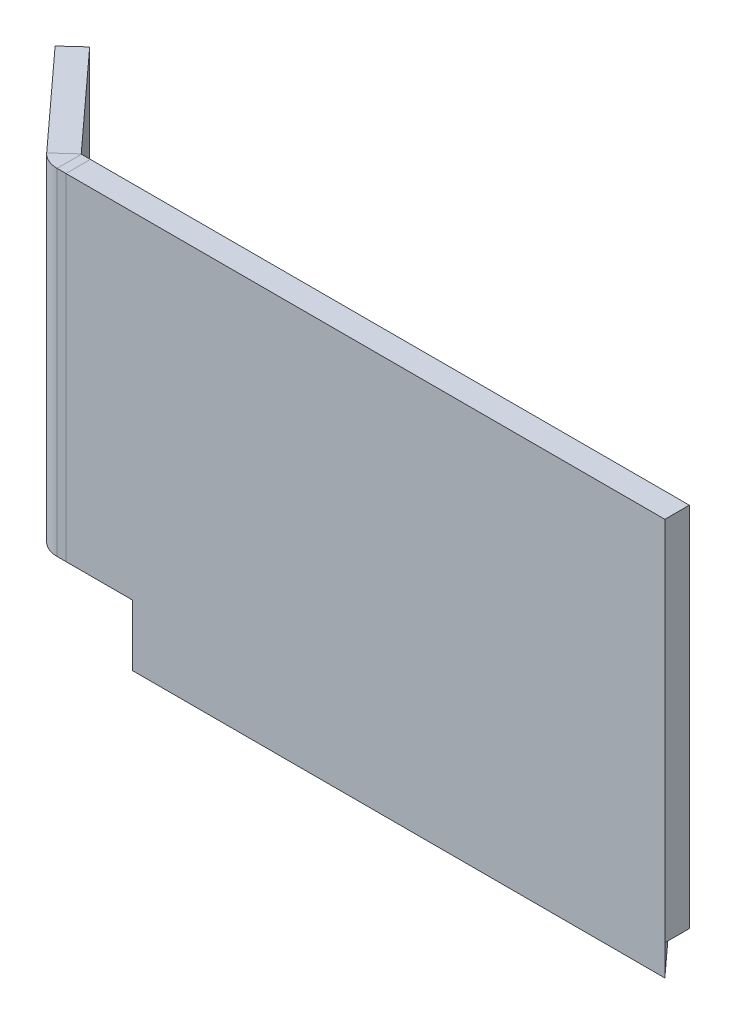
ISO-10303-21;
HEADER;
FILE_DESCRIPTION(('STEP AP214'),'2;1');
FILE_NAME('part.step','',(''),(''),'','','');
FILE_SCHEMA(('AUTOMOTIVE_DESIGN { 1 0 10303 214 1 1 1 1 }'));
ENDSEC;
DATA;
#1=APPLICATION_CONTEXT('core data for automotive mechanical design processes');
#2=APPLICATION_PROTOCOL_DEFINITION('international standard','automotive_design',2000,#1);
#3=PRODUCT_CONTEXT('',#1,'mechanical');
#4=PRODUCT('Part','Part','',(#3));
#5=PRODUCT_RELATED_PRODUCT_CATEGORY('part','',(#4));
#6=PRODUCT_DEFINITION_FORMATION('','',#4);
#7=PRODUCT_DEFINITION_CONTEXT('part definition',#1,'design');
#8=PRODUCT_DEFINITION('design','',#6,#7);
#9=PRODUCT_DEFINITION_SHAPE('','',#8);
#10=(LENGTH_UNIT() NAMED_UNIT(*) SI_UNIT(.MILLI.,.METRE.));
#11=(NAMED_UNIT(*) PLANE_ANGLE_UNIT() SI_UNIT($,.RADIAN.));
#12=(NAMED_UNIT(*) SI_UNIT($,.STERADIAN.) SOLID_ANGLE_UNIT());
#13=UNCERTAINTY_MEASURE_WITH_UNIT(LENGTH_MEASURE(1.E-05),#10,'distance_accuracy_value','');
#14=(GEOMETRIC_REPRESENTATION_CONTEXT(3) GLOBAL_UNCERTAINTY_ASSIGNED_CONTEXT((#13)) GLOBAL_UNIT_ASSIGNED_CONTEXT((#10,
#11,#12)) REPRESENTATION_CONTEXT('',''));
#15=CARTESIAN_POINT('',(0.,0.,0.));
#16=DIRECTION('',(0.,0.,1.));
#17=DIRECTION('',(1.,0.,0.));
#18=AXIS2_PLACEMENT_3D('',#15,#16,#17);
#19=CARTESIAN_POINT('',(-99.5000000000001,60.,0.));
#20=DIRECTION('',(0.,0.,1.));
#21=DIRECTION('',(0.,-1.,0.));
#22=AXIS2_PLACEMENT_3D('',#19,#20,#21);
#23=PLANE('',#22);
#24=DIRECTION('',(0.,-1.,0.));
#25=VECTOR('',#24,1.);
#26=CARTESIAN_POINT('',(-98.0000000000001,60.,0.));
#27=LINE('',#26,#25);
#28=CARTESIAN_POINT('',(-98.0000000000001,60.,0.));
#29=VERTEX_POINT('',#28);
#30=CARTESIAN_POINT('',(-98.0000000000001,5.,0.));
#31=VERTEX_POINT('',#30);
#32=EDGE_CURVE('E153',#29,#31,#27,.T.);
#33=ORIENTED_EDGE('',*,*,#32,.T.);
#34=DIRECTION('',(-1.,0.,0.));
#35=VECTOR('',#34,1.);
#36=CARTESIAN_POINT('',(-99.5000000000001,5.,0.));
#37=LINE('',#36,#35);
#38=CARTESIAN_POINT('',(-99.4558872835853,5.,0.));
#39=VERTEX_POINT('',#38);
#40=EDGE_CURVE('E175',#31,#39,#37,.T.);
#41=ORIENTED_EDGE('',*,*,#40,.T.);
#42=DIRECTION('',(0.,1.,0.));
#43=VECTOR('',#42,1.);
#44=CARTESIAN_POINT('',(-99.4558872835853,60.,0.));
#45=LINE('',#44,#43);
#46=CARTESIAN_POINT('',(-99.4558872835853,60.,0.));
#47=VERTEX_POINT('',#46);
#48=EDGE_CURVE('E146',#47,#39,#45,.F.);
#49=ORIENTED_EDGE('',*,*,#48,.F.);
#50=DIRECTION('',(1.,0.,0.));
#51=VECTOR('',#50,1.);
#52=CARTESIAN_POINT('',(-99.5000000000001,60.,0.));
#53=LINE('',#52,#51);
#54=EDGE_CURVE('E66',#47,#29,#53,.T.);
#55=ORIENTED_EDGE('',*,*,#54,.T.);
#56=EDGE_LOOP('',(#33,#41,#49,#55));
#57=FACE_BOUND('',#56,.T.);
#58=ADVANCED_FACE('F45',(#57),#23,.F.);
#59=CARTESIAN_POINT('',(-99.5000000000001,60.,4.));
#60=DIRECTION('',(0.,0.,1.));
#61=DIRECTION('',(0.,-1.,0.));
#62=AXIS2_PLACEMENT_3D('',#59,#60,#61);
#63=PLANE('',#62);
#64=DIRECTION('',(-1.,0.,0.));
#65=VECTOR('',#64,1.);
#66=CARTESIAN_POINT('',(-99.5000000000001,5.,4.));
#67=LINE('',#66,#65);
#68=CARTESIAN_POINT('',(-98.0000000000001,5.,4.));
#69=VERTEX_POINT('',#68);
#70=CARTESIAN_POINT('',(-99.4558872835853,5.,4.));
#71=VERTEX_POINT('',#70);
#72=EDGE_CURVE('E169',#69,#71,#67,.T.);
#73=ORIENTED_EDGE('',*,*,#72,.F.);
#74=DIRECTION('',(0.,-1.,0.));
#75=VECTOR('',#74,1.);
#76=CARTESIAN_POINT('',(-98.0000000000001,60.,4.));
#77=LINE('',#76,#75);
#78=CARTESIAN_POINT('',(-98.0000000000001,60.,4.));
#79=VERTEX_POINT('',#78);
#80=EDGE_CURVE('E155',#79,#69,#77,.T.);
#81=ORIENTED_EDGE('',*,*,#80,.F.);
#82=DIRECTION('',(1.,0.,0.));
#83=VECTOR('',#82,1.);
#84=CARTESIAN_POINT('',(-99.5000000000001,60.,4.));
#85=LINE('',#84,#83);
#86=CARTESIAN_POINT('',(-99.4558872835853,60.,4.));
#87=VERTEX_POINT('',#86);
#88=EDGE_CURVE('E52',#87,#79,#85,.T.);
#89=ORIENTED_EDGE('',*,*,#88,.F.);
#90=DIRECTION('',(0.,1.,0.));
#91=VECTOR('',#90,1.);
#92=CARTESIAN_POINT('',(-99.4558872835853,60.,4.));
#93=LINE('',#92,#91);
#94=EDGE_CURVE('E139',#87,#71,#93,.F.);
#95=ORIENTED_EDGE('',*,*,#94,.T.);
#96=EDGE_LOOP('',(#73,#81,#89,#95));
#97=FACE_BOUND('',#96,.T.);
#98=ADVANCED_FACE('F168',(#97),#63,.T.);
#99=CARTESIAN_POINT('',(-99.5000000000001,60.,0.));
#100=DIRECTION('',(0.,1.,0.));
#101=DIRECTION('',(0.,0.,1.));
#102=AXIS2_PLACEMENT_3D('',#99,#100,#101);
#103=PLANE('',#102);
#104=ORIENTED_EDGE('',*,*,#54,.F.);
#105=DIRECTION('',(0.,0.,1.));
#106=VECTOR('',#105,1.);
#107=CARTESIAN_POINT('',(-99.4558872835853,60.,0.));
#108=LINE('',#107,#106);
#109=EDGE_CURVE('E142',#47,#87,#108,.T.);
#110=ORIENTED_EDGE('',*,*,#109,.T.);
#111=ORIENTED_EDGE('',*,*,#88,.T.);
#112=DIRECTION('',(0.,0.,1.));
#113=VECTOR('',#112,1.);
#114=CARTESIAN_POINT('',(-98.0000000000001,60.,0.));
#115=LINE('',#114,#113);
#116=EDGE_CURVE('E158',#29,#79,#115,.T.);
#117=ORIENTED_EDGE('',*,*,#116,.F.);
#118=EDGE_LOOP('',(#104,#110,#111,#117));
#119=FACE_BOUND('',#118,.T.);
#120=ADVANCED_FACE('F165',(#119),#103,.T.);
#121=CARTESIAN_POINT('',(-98.0000000000001,-5.,0.));
#122=DIRECTION('',(1.,0.,0.));
#123=DIRECTION('',(0.,0.,-1.));
#124=AXIS2_PLACEMENT_3D('',#121,#122,#123);
#125=PLANE('',#124);
#126=DIRECTION('',(0.,0.,1.));
#127=VECTOR('',#126,1.);
#128=CARTESIAN_POINT('',(-98.0000000000001,4.99999999999999,0.));
#129=LINE('',#128,#127);
#130=EDGE_CURVE('E173',#31,#69,#129,.T.);
#131=ORIENTED_EDGE('',*,*,#130,.F.);
#132=ORIENTED_EDGE('',*,*,#32,.F.);
#133=ORIENTED_EDGE('',*,*,#116,.T.);
#134=ORIENTED_EDGE('',*,*,#80,.T.);
#135=EDGE_LOOP('',(#131,#132,#133,#134));
#136=FACE_BOUND('',#135,.T.);
#137=ADVANCED_FACE('F172',(#136),#125,.T.);
#138=CARTESIAN_POINT('',(-99.4558872835853,60.,-0.0999999999999924));
#139=DIRECTION('',(0.,-1.,0.));
#140=DIRECTION('',(0.,0.,-1.));
#141=AXIS2_PLACEMENT_3D('',#138,#139,#140);
#142=PLANE('',#141);
#143=CARTESIAN_POINT('',(-99.4558872835853,60.,-0.0999999999999924));
#144=DIRECTION('',(0.,1.,0.));
#145=DIRECTION('',(0.,0.,1.));
#146=AXIS2_PLACEMENT_3D('',#143,#144,#145);
#147=CIRCLE('',#146,0.0999999999999915);
#148=CARTESIAN_POINT('',(-99.5297412404634,60.,-0.0325789865586911));
#149=VERTEX_POINT('',#148);
#150=EDGE_CURVE('E138',#149,#47,#147,.T.);
#151=ORIENTED_EDGE('',*,*,#150,.F.);
#152=DIRECTION('',(-0.738539568780651,0.,0.674210134413071));
#153=VECTOR('',#152,1.);
#154=CARTESIAN_POINT('',(-99.5297412404634,60.,-0.0325789865587012));
#155=LINE('',#154,#153);
#156=CARTESIAN_POINT('',(-102.483899515586,60.,2.66426155109359));
#157=VERTEX_POINT('',#156);
#158=EDGE_CURVE('E131',#149,#157,#155,.T.);
#159=ORIENTED_EDGE('',*,*,#158,.T.);
#160=CARTESIAN_POINT('',(-99.4558872835853,60.,-0.0999999999999924));
#161=DIRECTION('',(0.,1.,0.));
#162=DIRECTION('',(0.,0.,1.));
#163=AXIS2_PLACEMENT_3D('',#160,#161,#162);
#164=CIRCLE('',#163,4.09999999999999);
#165=EDGE_CURVE('E143',#157,#87,#164,.T.);
#166=ORIENTED_EDGE('',*,*,#165,.T.);
#167=ORIENTED_EDGE('',*,*,#109,.F.);
#168=EDGE_LOOP('',(#151,#159,#166,#167));
#169=FACE_BOUND('',#168,.T.);
#170=ADVANCED_FACE('F183',(#169),#142,.F.);
#171=CARTESIAN_POINT('',(-99.4558872835853,60.,-0.0999999999999924));
#172=DIRECTION('',(0.,1.,0.));
#173=DIRECTION('',(-0.738539568780651,0.,0.674210134413071));
#174=AXIS2_PLACEMENT_3D('',#171,#172,#173);
#175=CYLINDRICAL_SURFACE('',#174,4.09999999999999);
#176=CARTESIAN_POINT('',(-99.4558872835853,5.,-0.0999999999999924));
#177=DIRECTION('',(0.,1.,0.));
#178=DIRECTION('',(0.,0.,1.));
#179=AXIS2_PLACEMENT_3D('',#176,#177,#178);
#180=CIRCLE('',#179,4.09999999999999);
#181=CARTESIAN_POINT('',(-102.483899515586,5.,2.66426155109359));
#182=VERTEX_POINT('',#181);
#183=EDGE_CURVE('E199',#71,#182,#180,.F.);
#184=ORIENTED_EDGE('',*,*,#183,.F.);
#185=ORIENTED_EDGE('',*,*,#94,.F.);
#186=ORIENTED_EDGE('',*,*,#165,.F.);
#187=DIRECTION('',(0.,1.,0.));
#188=VECTOR('',#187,1.);
#189=CARTESIAN_POINT('',(-102.483899515586,60.,2.66426155109359));
#190=LINE('',#189,#188);
#191=EDGE_CURVE('E127',#182,#157,#190,.T.);
#192=ORIENTED_EDGE('',*,*,#191,.F.);
#193=EDGE_LOOP('',(#184,#185,#186,#192));
#194=FACE_BOUND('',#193,.T.);
#195=ADVANCED_FACE('F198',(#194),#175,.T.);
#196=CARTESIAN_POINT('',(-99.4558872835853,60.,-0.0999999999999924));
#197=DIRECTION('',(0.,1.,0.));
#198=DIRECTION('',(-0.738539568780651,0.,0.674210134413071));
#199=AXIS2_PLACEMENT_3D('',#196,#197,#198);
#200=CYLINDRICAL_SURFACE('',#199,0.0999999999999915);
#201=ORIENTED_EDGE('',*,*,#48,.T.);
#202=CARTESIAN_POINT('',(-99.4558872835853,5.,-0.0999999999999924));
#203=DIRECTION('',(0.,1.,0.));
#204=DIRECTION('',(0.,0.,1.));
#205=AXIS2_PLACEMENT_3D('',#202,#203,#204);
#206=CIRCLE('',#205,0.0999999999999915);
#207=CARTESIAN_POINT('',(-99.5297412404634,5.,-0.0325789865586907));
#208=VERTEX_POINT('',#207);
#209=EDGE_CURVE('E179',#39,#208,#206,.F.);
#210=ORIENTED_EDGE('',*,*,#209,.T.);
#211=DIRECTION('',(0.,1.,0.));
#212=VECTOR('',#211,1.);
#213=CARTESIAN_POINT('',(-99.5297412404634,-5.,-0.0325789865587012));
#214=LINE('',#213,#212);
#215=EDGE_CURVE('E120',#208,#149,#214,.T.);
#216=ORIENTED_EDGE('',*,*,#215,.T.);
#217=ORIENTED_EDGE('',*,*,#150,.T.);
#218=EDGE_LOOP('',(#201,#210,#216,#217));
#219=FACE_BOUND('',#218,.T.);
#220=ADVANCED_FACE('F178',(#219),#200,.F.);
#221=CARTESIAN_POINT('',(-102.454158275123,60.,2.69684053765229));
#222=DIRECTION('',(0.,1.,0.));
#223=DIRECTION('',(-1.,0.,0.));
#224=AXIS2_PLACEMENT_3D('',#221,#222,#223);
#225=PLANE('',#224);
#226=DIRECTION('',(0.674210134413071,0.,0.73853956878065));
#227=VECTOR('',#226,1.);
#228=CARTESIAN_POINT('',(-102.454158275123,60.,2.69684053765229));
#229=LINE('',#228,#227);
#230=CARTESIAN_POINT('',(-116.949676165004,60.,-13.1817601911317));
#231=VERTEX_POINT('',#230);
#232=EDGE_CURVE('E134',#231,#157,#229,.T.);
#233=ORIENTED_EDGE('',*,*,#232,.T.);
#234=ORIENTED_EDGE('',*,*,#158,.F.);
#235=DIRECTION('',(0.674210134413071,0.,0.73853956878065));
#236=VECTOR('',#235,1.);
#237=CARTESIAN_POINT('',(-99.5000000000001,60.,0.));
#238=LINE('',#237,#236);
#239=CARTESIAN_POINT('',(-113.995517889881,60.,-15.878600728784));
#240=VERTEX_POINT('',#239);
#241=EDGE_CURVE('E126',#240,#149,#238,.T.);
#242=ORIENTED_EDGE('',*,*,#241,.F.);
#243=DIRECTION('',(0.73853956878065,0.,-0.674210134413071));
#244=VECTOR('',#243,1.);
#245=CARTESIAN_POINT('',(-116.949676165004,60.,-13.1817601911317));
#246=LINE('',#245,#244);
#247=EDGE_CURVE('E124',#231,#240,#246,.T.);
#248=ORIENTED_EDGE('',*,*,#247,.F.);
#249=EDGE_LOOP('',(#233,#234,#242,#248));
#250=FACE_BOUND('',#249,.T.);
#251=ADVANCED_FACE('F187',(#250),#225,.T.);
#252=CARTESIAN_POINT('',(-102.454158275123,60.,2.69684053765229));
#253=DIRECTION('',(-0.738539568780651,0.,0.674210134413071));
#254=DIRECTION('',(0.674210134413071,0.,0.738539568780651));
#255=AXIS2_PLACEMENT_3D('',#252,#253,#254);
#256=PLANE('',#255);
#257=DIRECTION('',(-0.674210134413071,0.,-0.738539568780651));
#258=VECTOR('',#257,1.);
#259=CARTESIAN_POINT('',(-102.454158275123,5.,2.69684053765232));
#260=LINE('',#259,#258);
#261=CARTESIAN_POINT('',(-116.949676165004,4.99999999999998,-13.1817601911317));
#262=VERTEX_POINT('',#261);
#263=EDGE_CURVE('E58',#182,#262,#260,.T.);
#264=ORIENTED_EDGE('',*,*,#263,.F.);
#265=ORIENTED_EDGE('',*,*,#191,.T.);
#266=ORIENTED_EDGE('',*,*,#232,.F.);
#267=DIRECTION('',(0.,1.,0.));
#268=VECTOR('',#267,1.);
#269=CARTESIAN_POINT('',(-116.949676165004,60.,-13.1817601911317));
#270=LINE('',#269,#268);
#271=EDGE_CURVE('E129',#262,#231,#270,.T.);
#272=ORIENTED_EDGE('',*,*,#271,.F.);
#273=EDGE_LOOP('',(#264,#265,#266,#272));
#274=FACE_BOUND('',#273,.T.);
#275=ADVANCED_FACE('F193',(#274),#256,.T.);
#276=CARTESIAN_POINT('',(-99.5000000000001,60.,0.));
#277=DIRECTION('',(-0.738539568780651,0.,0.674210134413071));
#278=DIRECTION('',(0.674210134413071,0.,0.738539568780651));
#279=AXIS2_PLACEMENT_3D('',#276,#277,#278);
#280=PLANE('',#279);
#281=ORIENTED_EDGE('',*,*,#215,.F.);
#282=DIRECTION('',(-0.674210134413071,0.,-0.738539568780651));
#283=VECTOR('',#282,1.);
#284=CARTESIAN_POINT('',(-99.5,5.,0.));
#285=LINE('',#284,#283);
#286=CARTESIAN_POINT('',(-113.995517889881,4.99999999999998,-15.878600728784));
#287=VERTEX_POINT('',#286);
#288=EDGE_CURVE('E109',#208,#287,#285,.T.);
#289=ORIENTED_EDGE('',*,*,#288,.T.);
#290=DIRECTION('',(0.,1.,0.));
#291=VECTOR('',#290,1.);
#292=CARTESIAN_POINT('',(-113.995517889881,60.,-15.878600728784));
#293=LINE('',#292,#291);
#294=EDGE_CURVE('E118',#287,#240,#293,.T.);
#295=ORIENTED_EDGE('',*,*,#294,.T.);
#296=ORIENTED_EDGE('',*,*,#241,.T.);
#297=EDGE_LOOP('',(#281,#289,#295,#296));
#298=FACE_BOUND('',#297,.T.);
#299=ADVANCED_FACE('F116',(#298),#280,.F.);
#300=CARTESIAN_POINT('',(-116.949676165004,60.,-13.1817601911317));
#301=DIRECTION('',(-0.674210134413071,0.,-0.73853956878065));
#302=DIRECTION('',(-0.73853956878065,0.,0.674210134413071));
#303=AXIS2_PLACEMENT_3D('',#300,#301,#302);
#304=PLANE('',#303);
#305=DIRECTION('',(0.73853956878065,0.,-0.674210134413071));
#306=VECTOR('',#305,1.);
#307=CARTESIAN_POINT('',(-116.949676165004,4.99999999999998,-13.1817601911317));
#308=LINE('',#307,#306);
#309=EDGE_CURVE('E12',#262,#287,#308,.T.);
#310=ORIENTED_EDGE('',*,*,#309,.F.);
#311=ORIENTED_EDGE('',*,*,#271,.T.);
#312=ORIENTED_EDGE('',*,*,#247,.T.);
#313=ORIENTED_EDGE('',*,*,#294,.F.);
#314=EDGE_LOOP('',(#310,#311,#312,#313));
#315=FACE_BOUND('',#314,.T.);
#316=ADVANCED_FACE('F122',(#315),#304,.T.);
#317=CARTESIAN_POINT('',(-139.186336644082,5.,5.81214605700012));
#318=DIRECTION('',(0.,1.,0.));
#319=DIRECTION('',(0.,0.,1.));
#320=AXIS2_PLACEMENT_3D('',#317,#318,#319);
#321=PLANE('',#320);
#322=ORIENTED_EDGE('',*,*,#130,.T.);
#323=ORIENTED_EDGE('',*,*,#72,.T.);
#324=ORIENTED_EDGE('',*,*,#183,.T.);
#325=ORIENTED_EDGE('',*,*,#263,.T.);
#326=ORIENTED_EDGE('',*,*,#309,.T.);
#327=ORIENTED_EDGE('',*,*,#288,.F.);
#328=ORIENTED_EDGE('',*,*,#209,.F.);
#329=ORIENTED_EDGE('',*,*,#40,.F.);
#330=EDGE_LOOP('',(#322,#323,#324,#325,#326,#327,#328,#329));
#331=FACE_BOUND('',#330,.T.);
#332=ADVANCED_FACE('F108',(#331),#321,.F.);
#333=CLOSED_SHELL('',(#58,#98,#120,#137,#170,#195,#220,#251,#275,#299,#316,#332));
#334=MANIFOLD_SOLID_BREP('B2',#333);
#335=CARTESIAN_POINT('',(-98.0000000000001,0.,-36.));
#336=DIRECTION('',(-1.,0.,0.));
#337=DIRECTION('',(0.,0.,1.));
#338=AXIS2_PLACEMENT_3D('',#335,#336,#337);
#339=PLANE('',#338);
#340=DIRECTION('',(0.,-1.,0.));
#341=VECTOR('',#340,1.);
#342=CARTESIAN_POINT('',(-98.0000000000001,0.,-16.4273387597281));
#343=LINE('',#342,#341);
#344=CARTESIAN_POINT('',(-98.0000000000001,0.,-16.4273387597281));
#345=VERTEX_POINT('',#344);
#346=CARTESIAN_POINT('',(-98.0000000000001,-5.00000000000002,-16.4273387597281));
#347=VERTEX_POINT('',#346);
#348=EDGE_CURVE('E431',#345,#347,#343,.T.);
#349=ORIENTED_EDGE('',*,*,#348,.F.);
#350=DIRECTION('',(0.,0.,1.));
#351=VECTOR('',#350,1.);
#352=CARTESIAN_POINT('',(-98.0000000000001,0.,0.));
#353=LINE('',#352,#351);
#354=CARTESIAN_POINT('',(-98.0000000000001,0.,-36.));
#355=VERTEX_POINT('',#354);
#356=EDGE_CURVE('E471',#355,#345,#353,.T.);
#357=ORIENTED_EDGE('',*,*,#356,.F.);
#358=DIRECTION('',(0.,1.,0.));
#359=VECTOR('',#358,1.);
#360=CARTESIAN_POINT('',(-98.0000000000001,0.,-36.));
#361=LINE('',#360,#359);
#362=CARTESIAN_POINT('',(-98.0000000000001,-5.,-36.));
#363=VERTEX_POINT('',#362);
#364=EDGE_CURVE('E482',#363,#355,#361,.T.);
#365=ORIENTED_EDGE('',*,*,#364,.F.);
#366=DIRECTION('',(0.,0.,-1.));
#367=VECTOR('',#366,1.);
#368=CARTESIAN_POINT('',(-98.0000000000001,-5.,-36.));
#369=LINE('',#368,#367);
#370=EDGE_CURVE('E480',#347,#363,#369,.T.);
#371=ORIENTED_EDGE('',*,*,#370,.F.);
#372=EDGE_LOOP('',(#349,#357,#365,#371));
#373=FACE_BOUND('',#372,.T.);
#374=ADVANCED_FACE('F323',(#373),#339,.T.);
#375=CARTESIAN_POINT('',(0.,0.,-36.));
#376=DIRECTION('',(-1.,0.,0.));
#377=DIRECTION('',(0.,0.,1.));
#378=AXIS2_PLACEMENT_3D('',#375,#376,#377);
#379=PLANE('',#378);
#380=DIRECTION('',(0.,0.,-1.));
#381=VECTOR('',#380,1.);
#382=CARTESIAN_POINT('',(0.,0.,4.));
#383=LINE('',#382,#381);
#384=CARTESIAN_POINT('',(0.,0.,4.));
#385=VERTEX_POINT('',#384);
#386=CARTESIAN_POINT('',(0.,0.,0.));
#387=VERTEX_POINT('',#386);
#388=EDGE_CURVE('E457',#385,#387,#383,.T.);
#389=ORIENTED_EDGE('',*,*,#388,.T.);
#390=DIRECTION('',(0.,1.,0.));
#391=VECTOR('',#390,1.);
#392=CARTESIAN_POINT('',(0.,0.,0.));
#393=LINE('',#392,#391);
#394=CARTESIAN_POINT('',(0.,60.,0.));
#395=VERTEX_POINT('',#394);
#396=EDGE_CURVE('E470',#387,#395,#393,.T.);
#397=ORIENTED_EDGE('',*,*,#396,.T.);
#398=DIRECTION('',(0.,0.,1.));
#399=VECTOR('',#398,1.);
#400=CARTESIAN_POINT('',(0.,60.,4.));
#401=LINE('',#400,#399);
#402=CARTESIAN_POINT('',(0.,60.,4.));
#403=VERTEX_POINT('',#402);
#404=EDGE_CURVE('E488',#395,#403,#401,.T.);
#405=ORIENTED_EDGE('',*,*,#404,.T.);
#406=DIRECTION('',(0.,-1.,0.));
#407=VECTOR('',#406,1.);
#408=CARTESIAN_POINT('',(0.,-5.,4.));
#409=LINE('',#408,#407);
#410=EDGE_CURVE('E473',#403,#385,#409,.T.);
#411=ORIENTED_EDGE('',*,*,#410,.T.);
#412=EDGE_LOOP('',(#389,#397,#405,#411));
#413=FACE_BOUND('',#412,.T.);
#414=ADVANCED_FACE('F512',(#413),#379,.F.);
#415=CARTESIAN_POINT('',(-98.0000000000001,0.,0.));
#416=DIRECTION('',(0.,1.,0.));
#417=DIRECTION('',(0.,0.,1.));
#418=AXIS2_PLACEMENT_3D('',#415,#416,#417);
#419=PLANE('',#418);
#420=DIRECTION('',(0.,0.,-1.));
#421=VECTOR('',#420,1.);
#422=CARTESIAN_POINT('',(-87.0665738758308,0.,0.));
#423=LINE('',#422,#421);
#424=CARTESIAN_POINT('',(-87.0665738758308,0.,0.));
#425=VERTEX_POINT('',#424);
#426=CARTESIAN_POINT('',(-87.0665738758308,0.,-16.4273387597281));
#427=VERTEX_POINT('',#426);
#428=EDGE_CURVE('E421',#425,#427,#423,.T.);
#429=ORIENTED_EDGE('',*,*,#428,.F.);
#430=DIRECTION('',(1.,0.,0.));
#431=VECTOR('',#430,1.);
#432=CARTESIAN_POINT('',(-98.0000000000001,0.,0.));
#433=LINE('',#432,#431);
#434=CARTESIAN_POINT('',(-3.65158571273954,0.,0.));
#435=VERTEX_POINT('',#434);
#436=EDGE_CURVE('E485',#425,#435,#433,.T.);
#437=ORIENTED_EDGE('',*,*,#436,.T.);
#438=DIRECTION('',(0.674210134413066,0.,0.738539568780655));
#439=VECTOR('',#438,1.);
#440=CARTESIAN_POINT('',(0.,0.,4.));
#441=LINE('',#440,#439);
#442=CARTESIAN_POINT('',(-36.5158571273954,0.,-36.));
#443=VERTEX_POINT('',#442);
#444=EDGE_CURVE('E458',#443,#435,#441,.T.);
#445=ORIENTED_EDGE('',*,*,#444,.F.);
#446=DIRECTION('',(1.,0.,0.));
#447=VECTOR('',#446,1.);
#448=CARTESIAN_POINT('',(-98.0000000000001,0.,-36.));
#449=LINE('',#448,#447);
#450=EDGE_CURVE('E340',#355,#443,#449,.T.);
#451=ORIENTED_EDGE('',*,*,#450,.F.);
#452=ORIENTED_EDGE('',*,*,#356,.T.);
#453=DIRECTION('',(-1.,0.,0.));
#454=VECTOR('',#453,1.);
#455=CARTESIAN_POINT('',(-98.0000000000001,0.,-16.4273387597281));
#456=LINE('',#455,#454);
#457=EDGE_CURVE('E448',#427,#345,#456,.T.);
#458=ORIENTED_EDGE('',*,*,#457,.F.);
#459=EDGE_LOOP('',(#429,#437,#445,#451,#452,#458));
#460=FACE_BOUND('',#459,.T.);
#461=ADVANCED_FACE('F325',(#460),#419,.T.);
#462=CARTESIAN_POINT('',(-98.0000000000001,0.,-36.));
#463=DIRECTION('',(0.,0.,-1.));
#464=DIRECTION('',(-1.,0.,0.));
#465=AXIS2_PLACEMENT_3D('',#462,#463,#464);
#466=PLANE('',#465);
#467=DIRECTION('',(0.,1.,0.));
#468=VECTOR('',#467,1.);
#469=CARTESIAN_POINT('',(-36.5158571273954,-5.,-36.));
#470=LINE('',#469,#468);
#471=CARTESIAN_POINT('',(-36.5158571273954,-5.,-36.));
#472=VERTEX_POINT('',#471);
#473=EDGE_CURVE('E463',#472,#443,#470,.T.);
#474=ORIENTED_EDGE('',*,*,#473,.F.);
#475=DIRECTION('',(1.,0.,0.));
#476=VECTOR('',#475,1.);
#477=CARTESIAN_POINT('',(-98.0000000000001,-5.,-36.));
#478=LINE('',#477,#476);
#479=EDGE_CURVE('E494',#363,#472,#478,.T.);
#480=ORIENTED_EDGE('',*,*,#479,.F.);
#481=ORIENTED_EDGE('',*,*,#364,.T.);
#482=ORIENTED_EDGE('',*,*,#450,.T.);
#483=EDGE_LOOP('',(#474,#480,#481,#482));
#484=FACE_BOUND('',#483,.T.);
#485=ADVANCED_FACE('F613',(#484),#466,.T.);
#486=CARTESIAN_POINT('',(-98.0000000000001,-5.,-36.));
#487=DIRECTION('',(0.,-1.,0.));
#488=DIRECTION('',(0.,0.,-1.));
#489=AXIS2_PLACEMENT_3D('',#486,#487,#488);
#490=PLANE('',#489);
#491=DIRECTION('',(0.,0.,1.));
#492=VECTOR('',#491,1.);
#493=CARTESIAN_POINT('',(-87.0665738758308,-5.00000000000002,-16.4273387597281));
#494=LINE('',#493,#492);
#495=CARTESIAN_POINT('',(-87.0665738758308,-5.00000000000002,-16.4273387597281));
#496=VERTEX_POINT('',#495);
#497=CARTESIAN_POINT('',(-87.0665738758308,-5.,4.));
#498=VERTEX_POINT('',#497);
#499=EDGE_CURVE('E418',#496,#498,#494,.T.);
#500=ORIENTED_EDGE('',*,*,#499,.F.);
#501=DIRECTION('',(1.,0.,0.));
#502=VECTOR('',#501,1.);
#503=CARTESIAN_POINT('',(-139.186336644082,-5.00000000000002,-16.4273387597281));
#504=LINE('',#503,#502);
#505=EDGE_CURVE('E428',#347,#496,#504,.T.);
#506=ORIENTED_EDGE('',*,*,#505,.F.);
#507=ORIENTED_EDGE('',*,*,#370,.T.);
#508=ORIENTED_EDGE('',*,*,#479,.T.);
#509=DIRECTION('',(0.674210134413066,0.,0.738539568780655));
#510=VECTOR('',#509,1.);
#511=CARTESIAN_POINT('',(0.,-5.,4.));
#512=LINE('',#511,#510);
#513=CARTESIAN_POINT('',(0.,-5.,4.));
#514=VERTEX_POINT('',#513);
#515=EDGE_CURVE('E454',#472,#514,#512,.T.);
#516=ORIENTED_EDGE('',*,*,#515,.T.);
#517=DIRECTION('',(1.,0.,0.));
#518=VECTOR('',#517,1.);
#519=CARTESIAN_POINT('',(-98.0000000000001,-5.,4.));
#520=LINE('',#519,#518);
#521=EDGE_CURVE('E438',#498,#514,#520,.T.);
#522=ORIENTED_EDGE('',*,*,#521,.F.);
#523=EDGE_LOOP('',(#500,#506,#507,#508,#516,#522));
#524=FACE_BOUND('',#523,.T.);
#525=ADVANCED_FACE('F436',(#524),#490,.T.);
#526=CARTESIAN_POINT('',(-98.0000000000001,-5.,4.));
#527=DIRECTION('',(0.,0.,1.));
#528=DIRECTION('',(0.,-1.,0.));
#529=AXIS2_PLACEMENT_3D('',#526,#527,#528);
#530=PLANE('',#529);
#531=DIRECTION('',(0.,1.,0.));
#532=VECTOR('',#531,1.);
#533=CARTESIAN_POINT('',(-87.0665738758308,-5.,4.));
#534=LINE('',#533,#532);
#535=CARTESIAN_POINT('',(-87.0665738758308,5.,4.));
#536=VERTEX_POINT('',#535);
#537=EDGE_CURVE('E446',#498,#536,#534,.T.);
#538=ORIENTED_EDGE('',*,*,#537,.F.);
#539=ORIENTED_EDGE('',*,*,#521,.T.);
#540=DIRECTION('',(0.,1.,0.));
#541=VECTOR('',#540,1.);
#542=CARTESIAN_POINT('',(0.,-5.,4.));
#543=LINE('',#542,#541);
#544=EDGE_CURVE('E456',#514,#385,#543,.T.);
#545=ORIENTED_EDGE('',*,*,#544,.T.);
#546=ORIENTED_EDGE('',*,*,#410,.F.);
#547=DIRECTION('',(1.,0.,0.));
#548=VECTOR('',#547,1.);
#549=CARTESIAN_POINT('',(-98.0000000000001,60.,4.));
#550=LINE('',#549,#548);
#551=CARTESIAN_POINT('',(-98.0000000000001,60.,4.));
#552=VERTEX_POINT('',#551);
#553=EDGE_CURVE('E363',#552,#403,#550,.T.);
#554=ORIENTED_EDGE('',*,*,#553,.F.);
#555=DIRECTION('',(0.,-1.,0.));
#556=VECTOR('',#555,1.);
#557=CARTESIAN_POINT('',(-98.0000000000001,-5.,4.));
#558=LINE('',#557,#556);
#559=CARTESIAN_POINT('',(-98.0000000000001,5.,4.));
#560=VERTEX_POINT('',#559);
#561=EDGE_CURVE('E477',#552,#560,#558,.T.);
#562=ORIENTED_EDGE('',*,*,#561,.T.);
#563=DIRECTION('',(-1.,0.,0.));
#564=VECTOR('',#563,1.);
#565=CARTESIAN_POINT('',(-98.0000000000001,5.,4.));
#566=LINE('',#565,#564);
#567=EDGE_CURVE('E424',#536,#560,#566,.T.);
#568=ORIENTED_EDGE('',*,*,#567,.F.);
#569=EDGE_LOOP('',(#538,#539,#545,#546,#554,#562,#568));
#570=FACE_BOUND('',#569,.T.);
#571=ADVANCED_FACE('F509',(#570),#530,.T.);
#572=CARTESIAN_POINT('',(-98.0000000000001,60.,4.));
#573=DIRECTION('',(0.,1.,0.));
#574=DIRECTION('',(0.,0.,1.));
#575=AXIS2_PLACEMENT_3D('',#572,#573,#574);
#576=PLANE('',#575);
#577=ORIENTED_EDGE('',*,*,#404,.F.);
#578=DIRECTION('',(1.,0.,0.));
#579=VECTOR('',#578,1.);
#580=CARTESIAN_POINT('',(-98.0000000000001,60.,0.));
#581=LINE('',#580,#579);
#582=CARTESIAN_POINT('',(-98.0000000000001,60.,0.));
#583=VERTEX_POINT('',#582);
#584=EDGE_CURVE('E356',#583,#395,#581,.T.);
#585=ORIENTED_EDGE('',*,*,#584,.F.);
#586=DIRECTION('',(0.,0.,1.));
#587=VECTOR('',#586,1.);
#588=CARTESIAN_POINT('',(-98.0000000000001,60.,4.));
#589=LINE('',#588,#587);
#590=EDGE_CURVE('E475',#583,#552,#589,.T.);
#591=ORIENTED_EDGE('',*,*,#590,.T.);
#592=ORIENTED_EDGE('',*,*,#553,.T.);
#593=EDGE_LOOP('',(#577,#585,#591,#592));
#594=FACE_BOUND('',#593,.T.);
#595=ADVANCED_FACE('F513',(#594),#576,.T.);
#596=CARTESIAN_POINT('',(-98.0000000000001,0.,0.));
#597=DIRECTION('',(0.,0.,-1.));
#598=DIRECTION('',(-1.,0.,0.));
#599=AXIS2_PLACEMENT_3D('',#596,#597,#598);
#600=PLANE('',#599);
#601=DIRECTION('',(0.,-1.,0.));
#602=VECTOR('',#601,1.);
#603=CARTESIAN_POINT('',(-87.0665738758308,0.,0.));
#604=LINE('',#603,#602);
#605=CARTESIAN_POINT('',(-87.0665738758308,5.,0.));
#606=VERTEX_POINT('',#605);
#607=EDGE_CURVE('E43',#606,#425,#604,.T.);
#608=ORIENTED_EDGE('',*,*,#607,.F.);
#609=DIRECTION('',(-1.,0.,0.));
#610=VECTOR('',#609,1.);
#611=CARTESIAN_POINT('',(-98.0000000000001,5.,0.));
#612=LINE('',#611,#610);
#613=CARTESIAN_POINT('',(-98.0000000000001,5.,0.));
#614=VERTEX_POINT('',#613);
#615=EDGE_CURVE('E451',#606,#614,#612,.T.);
#616=ORIENTED_EDGE('',*,*,#615,.T.);
#617=DIRECTION('',(0.,1.,0.));
#618=VECTOR('',#617,1.);
#619=CARTESIAN_POINT('',(-98.0000000000001,0.,0.));
#620=LINE('',#619,#618);
#621=EDGE_CURVE('E368',#614,#583,#620,.T.);
#622=ORIENTED_EDGE('',*,*,#621,.T.);
#623=ORIENTED_EDGE('',*,*,#584,.T.);
#624=ORIENTED_EDGE('',*,*,#396,.F.);
#625=DIRECTION('',(-1.,0.,0.));
#626=VECTOR('',#625,1.);
#627=CARTESIAN_POINT('',(-98.0000000000001,0.,0.));
#628=LINE('',#627,#626);
#629=EDGE_CURVE('E465',#387,#435,#628,.T.);
#630=ORIENTED_EDGE('',*,*,#629,.T.);
#631=ORIENTED_EDGE('',*,*,#436,.F.);
#632=EDGE_LOOP('',(#608,#616,#622,#623,#624,#630,#631));
#633=FACE_BOUND('',#632,.T.);
#634=ADVANCED_FACE('F515',(#633),#600,.T.);
#635=DIRECTION('',(0.,0.,1.));
#636=VECTOR('',#635,1.);
#637=CARTESIAN_POINT('',(-98.0000000000001,5.,-36.));
#638=LINE('',#637,#636);
#639=EDGE_CURVE('E332',#614,#560,#638,.T.);
#640=ORIENTED_EDGE('',*,*,#639,.T.);
#641=ORIENTED_EDGE('',*,*,#561,.F.);
#642=ORIENTED_EDGE('',*,*,#590,.F.);
#643=ORIENTED_EDGE('',*,*,#621,.F.);
#644=EDGE_LOOP('',(#640,#641,#642,#643));
#645=FACE_BOUND('',#644,.T.);
#646=ADVANCED_FACE('F502',(#645),#339,.T.);
#647=CARTESIAN_POINT('',(0.,-5.,4.));
#648=DIRECTION('',(-0.738539568780655,0.,0.674210134413066));
#649=DIRECTION('',(0.674210134413066,0.,0.738539568780655));
#650=AXIS2_PLACEMENT_3D('',#647,#648,#649);
#651=PLANE('',#650);
#652=ORIENTED_EDGE('',*,*,#444,.T.);
#653=EDGE_CURVE('E453',#435,#385,#441,.T.);
#654=ORIENTED_EDGE('',*,*,#653,.T.);
#655=ORIENTED_EDGE('',*,*,#544,.F.);
#656=ORIENTED_EDGE('',*,*,#515,.F.);
#657=ORIENTED_EDGE('',*,*,#473,.T.);
#658=EDGE_LOOP('',(#652,#654,#655,#656,#657));
#659=FACE_BOUND('',#658,.T.);
#660=ADVANCED_FACE('F535',(#659),#651,.F.);
#661=CARTESIAN_POINT('',(-36.5158571273954,0.,-36.));
#662=DIRECTION('',(0.,-1.,0.));
#663=DIRECTION('',(0.,0.,-1.));
#664=AXIS2_PLACEMENT_3D('',#661,#662,#663);
#665=PLANE('',#664);
#666=ORIENTED_EDGE('',*,*,#388,.F.);
#667=ORIENTED_EDGE('',*,*,#653,.F.);
#668=ORIENTED_EDGE('',*,*,#629,.F.);
#669=EDGE_LOOP('',(#666,#667,#668));
#670=FACE_BOUND('',#669,.T.);
#671=ADVANCED_FACE('F540',(#670),#665,.T.);
#672=CARTESIAN_POINT('',(-99.9967541227222,5.,-15.8101169635337));
#673=DIRECTION('',(0.,-1.,0.));
#674=DIRECTION('',(0.,0.,-1.));
#675=AXIS2_PLACEMENT_3D('',#672,#673,#674);
#676=PLANE('',#675);
#677=ORIENTED_EDGE('',*,*,#615,.F.);
#678=DIRECTION('',(0.,0.,1.));
#679=VECTOR('',#678,1.);
#680=CARTESIAN_POINT('',(-87.0665738758308,4.99999999999998,-16.4273387597281));
#681=LINE('',#680,#679);
#682=EDGE_CURVE('E425',#606,#536,#681,.T.);
#683=ORIENTED_EDGE('',*,*,#682,.T.);
#684=ORIENTED_EDGE('',*,*,#567,.T.);
#685=ORIENTED_EDGE('',*,*,#639,.F.);
#686=EDGE_LOOP('',(#677,#683,#684,#685));
#687=FACE_BOUND('',#686,.T.);
#688=ADVANCED_FACE('F506',(#687),#676,.T.);
#689=CARTESIAN_POINT('',(-87.0665738758308,4.99999999999998,-16.4273387597281));
#690=DIRECTION('',(1.,0.,0.));
#691=DIRECTION('',(0.,0.,-1.));
#692=AXIS2_PLACEMENT_3D('',#689,#690,#691);
#693=PLANE('',#692);
#694=ORIENTED_EDGE('',*,*,#537,.T.);
#695=ORIENTED_EDGE('',*,*,#682,.F.);
#696=ORIENTED_EDGE('',*,*,#607,.T.);
#697=ORIENTED_EDGE('',*,*,#428,.T.);
#698=DIRECTION('',(0.,-1.,0.));
#699=VECTOR('',#698,1.);
#700=CARTESIAN_POINT('',(-87.0665738758308,4.99999999999998,-16.4273387597281));
#701=LINE('',#700,#699);
#702=EDGE_CURVE('E414',#427,#496,#701,.T.);
#703=ORIENTED_EDGE('',*,*,#702,.T.);
#704=ORIENTED_EDGE('',*,*,#499,.T.);
#705=EDGE_LOOP('',(#694,#695,#696,#697,#703,#704));
#706=FACE_BOUND('',#705,.T.);
#707=ADVANCED_FACE('F416',(#706),#693,.F.);
#708=CARTESIAN_POINT('',(-139.186336644082,4.99999999999998,-16.4273387597281));
#709=DIRECTION('',(0.,0.,-1.));
#710=DIRECTION('',(0.,1.,0.));
#711=AXIS2_PLACEMENT_3D('',#708,#709,#710);
#712=PLANE('',#711);
#713=ORIENTED_EDGE('',*,*,#348,.T.);
#714=ORIENTED_EDGE('',*,*,#505,.T.);
#715=ORIENTED_EDGE('',*,*,#702,.F.);
#716=ORIENTED_EDGE('',*,*,#457,.T.);
#717=EDGE_LOOP('',(#713,#714,#715,#716));
#718=FACE_BOUND('',#717,.T.);
#719=ADVANCED_FACE('F429',(#718),#712,.F.);
#720=CLOSED_SHELL('',(#374,#414,#461,#485,#525,#571,#595,#634,#646,#660,#671,#688,#707,#719));
#721=MANIFOLD_SOLID_BREP('B6',#720);
#722=ADVANCED_BREP_SHAPE_REPRESENTATION('',(#18,#334,#721),#14);
#723=SHAPE_DEFINITION_REPRESENTATION(#9,#722);
ENDSEC;
END-ISO-10303-21;
